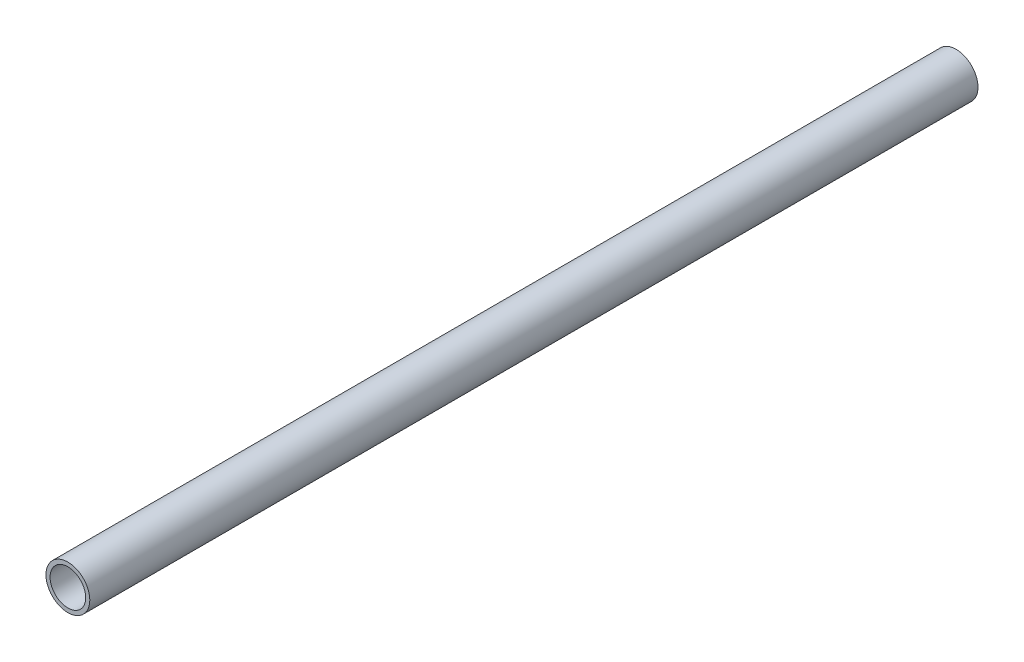
ISO-10303-21;
HEADER;
FILE_DESCRIPTION(('STEP AP214'),'2;1');
FILE_NAME('part.step','',(''),(''),'','','');
FILE_SCHEMA(('AUTOMOTIVE_DESIGN { 1 0 10303 214 1 1 1 1 }'));
ENDSEC;
DATA;
#1=APPLICATION_CONTEXT('core data for automotive mechanical design processes');
#2=APPLICATION_PROTOCOL_DEFINITION('international standard','automotive_design',2000,#1);
#3=PRODUCT_CONTEXT('',#1,'mechanical');
#4=PRODUCT('Part','Part','',(#3));
#5=PRODUCT_RELATED_PRODUCT_CATEGORY('part','',(#4));
#6=PRODUCT_DEFINITION_FORMATION('','',#4);
#7=PRODUCT_DEFINITION_CONTEXT('part definition',#1,'design');
#8=PRODUCT_DEFINITION('design','',#6,#7);
#9=PRODUCT_DEFINITION_SHAPE('','',#8);
#10=(LENGTH_UNIT() NAMED_UNIT(*) SI_UNIT(.MILLI.,.METRE.));
#11=(NAMED_UNIT(*) PLANE_ANGLE_UNIT() SI_UNIT($,.RADIAN.));
#12=(NAMED_UNIT(*) SI_UNIT($,.STERADIAN.) SOLID_ANGLE_UNIT());
#13=UNCERTAINTY_MEASURE_WITH_UNIT(LENGTH_MEASURE(1.E-05),#10,'distance_accuracy_value','');
#14=(GEOMETRIC_REPRESENTATION_CONTEXT(3) GLOBAL_UNCERTAINTY_ASSIGNED_CONTEXT((#13)) GLOBAL_UNIT_ASSIGNED_CONTEXT((#10,
#11,#12)) REPRESENTATION_CONTEXT('',''));
#15=CARTESIAN_POINT('',(0.,0.,0.));
#16=DIRECTION('',(0.,0.,1.));
#17=DIRECTION('',(1.,0.,0.));
#18=AXIS2_PLACEMENT_3D('',#15,#16,#17);
#19=CARTESIAN_POINT('',(0.,0.,193.));
#20=DIRECTION('',(0.,0.,1.));
#21=DIRECTION('',(1.,0.,0.));
#22=AXIS2_PLACEMENT_3D('',#19,#20,#21);
#23=PLANE('',#22);
#24=CARTESIAN_POINT('',(0.,0.,193.));
#25=DIRECTION('',(0.,0.,1.));
#26=DIRECTION('',(1.,0.,0.));
#27=AXIS2_PLACEMENT_3D('',#24,#25,#26);
#28=CIRCLE('',#27,4.7625);
#29=CARTESIAN_POINT('',(4.7625,0.,193.));
#30=VERTEX_POINT('',#29);
#31=EDGE_CURVE('E10',#30,#30,#28,.T.);
#32=ORIENTED_EDGE('',*,*,#31,.T.);
#33=EDGE_LOOP('',(#32));
#34=FACE_BOUND('',#33,.T.);
#35=CARTESIAN_POINT('',(0.,0.,193.));
#36=DIRECTION('',(0.,0.,1.));
#37=DIRECTION('',(1.,0.,0.));
#38=AXIS2_PLACEMENT_3D('',#35,#36,#37);
#39=CIRCLE('',#38,3.8735);
#40=CARTESIAN_POINT('',(3.8735,0.,193.));
#41=VERTEX_POINT('',#40);
#42=EDGE_CURVE('E54',#41,#41,#39,.T.);
#43=ORIENTED_EDGE('',*,*,#42,.F.);
#44=EDGE_LOOP('',(#43));
#45=FACE_BOUND('',#44,.T.);
#46=ADVANCED_FACE('F41',(#34,#45),#23,.T.);
#47=CARTESIAN_POINT('',(0.,0.,0.));
#48=DIRECTION('',(0.,0.,1.));
#49=DIRECTION('',(1.,0.,0.));
#50=AXIS2_PLACEMENT_3D('',#47,#48,#49);
#51=PLANE('',#50);
#52=CARTESIAN_POINT('',(0.,0.,0.));
#53=DIRECTION('',(0.,0.,1.));
#54=DIRECTION('',(1.,0.,0.));
#55=AXIS2_PLACEMENT_3D('',#52,#53,#54);
#56=CIRCLE('',#55,4.7625);
#57=CARTESIAN_POINT('',(4.7625,0.,0.));
#58=VERTEX_POINT('',#57);
#59=EDGE_CURVE('E45',#58,#58,#56,.T.);
#60=ORIENTED_EDGE('',*,*,#59,.F.);
#61=EDGE_LOOP('',(#60));
#62=FACE_BOUND('',#61,.T.);
#63=CARTESIAN_POINT('',(0.,0.,0.));
#64=DIRECTION('',(0.,0.,1.));
#65=DIRECTION('',(1.,0.,0.));
#66=AXIS2_PLACEMENT_3D('',#63,#64,#65);
#67=CIRCLE('',#66,3.8735);
#68=CARTESIAN_POINT('',(3.8735,0.,0.));
#69=VERTEX_POINT('',#68);
#70=EDGE_CURVE('E56',#69,#69,#67,.T.);
#71=ORIENTED_EDGE('',*,*,#70,.T.);
#72=EDGE_LOOP('',(#71));
#73=FACE_BOUND('',#72,.T.);
#74=ADVANCED_FACE('F68',(#62,#73),#51,.F.);
#75=CARTESIAN_POINT('',(0.,0.,193.));
#76=DIRECTION('',(0.,0.,-1.));
#77=DIRECTION('',(-1.,0.,0.));
#78=AXIS2_PLACEMENT_3D('',#75,#76,#77);
#79=CYLINDRICAL_SURFACE('',#78,4.7625);
#80=ORIENTED_EDGE('',*,*,#31,.F.);
#81=EDGE_LOOP('',(#80));
#82=FACE_BOUND('',#81,.T.);
#83=ORIENTED_EDGE('',*,*,#59,.T.);
#84=EDGE_LOOP('',(#83));
#85=FACE_BOUND('',#84,.T.);
#86=ADVANCED_FACE('F43',(#82,#85),#79,.T.);
#87=CARTESIAN_POINT('',(0.,0.,193.));
#88=DIRECTION('',(0.,0.,-1.));
#89=DIRECTION('',(-1.,0.,0.));
#90=AXIS2_PLACEMENT_3D('',#87,#88,#89);
#91=CYLINDRICAL_SURFACE('',#90,3.8735);
#92=ORIENTED_EDGE('',*,*,#42,.T.);
#93=EDGE_LOOP('',(#92));
#94=FACE_BOUND('',#93,.T.);
#95=ORIENTED_EDGE('',*,*,#70,.F.);
#96=EDGE_LOOP('',(#95));
#97=FACE_BOUND('',#96,.T.);
#98=ADVANCED_FACE('F64',(#94,#97),#91,.F.);
#99=CLOSED_SHELL('',(#46,#74,#86,#98));
#100=MANIFOLD_SOLID_BREP('B2',#99);
#101=ADVANCED_BREP_SHAPE_REPRESENTATION('',(#18,#100),#14);
#102=SHAPE_DEFINITION_REPRESENTATION(#9,#101);
ENDSEC;
END-ISO-10303-21;
